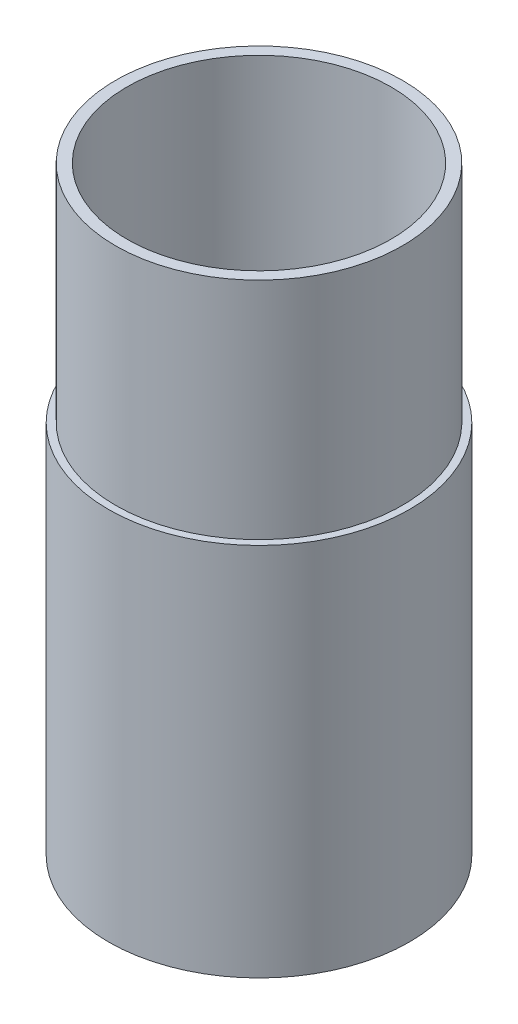
ISO-10303-21;
HEADER;
FILE_DESCRIPTION(('STEP AP214'),'2;1');
FILE_NAME('part.step','',(''),(''),'','','');
FILE_SCHEMA(('AUTOMOTIVE_DESIGN { 1 0 10303 214 1 1 1 1 }'));
ENDSEC;
DATA;
#1=APPLICATION_CONTEXT('core data for automotive mechanical design processes');
#2=APPLICATION_PROTOCOL_DEFINITION('international standard','automotive_design',2000,#1);
#3=PRODUCT_CONTEXT('',#1,'mechanical');
#4=PRODUCT('Part','Part','',(#3));
#5=PRODUCT_RELATED_PRODUCT_CATEGORY('part','',(#4));
#6=PRODUCT_DEFINITION_FORMATION('','',#4);
#7=PRODUCT_DEFINITION_CONTEXT('part definition',#1,'design');
#8=PRODUCT_DEFINITION('design','',#6,#7);
#9=PRODUCT_DEFINITION_SHAPE('','',#8);
#10=(LENGTH_UNIT() NAMED_UNIT(*) SI_UNIT(.MILLI.,.METRE.));
#11=(NAMED_UNIT(*) PLANE_ANGLE_UNIT() SI_UNIT($,.RADIAN.));
#12=(NAMED_UNIT(*) SI_UNIT($,.STERADIAN.) SOLID_ANGLE_UNIT());
#13=UNCERTAINTY_MEASURE_WITH_UNIT(LENGTH_MEASURE(1.E-05),#10,'distance_accuracy_value','');
#14=(GEOMETRIC_REPRESENTATION_CONTEXT(3) GLOBAL_UNCERTAINTY_ASSIGNED_CONTEXT((#13)) GLOBAL_UNIT_ASSIGNED_CONTEXT((#10,
#11,#12)) REPRESENTATION_CONTEXT('',''));
#15=CARTESIAN_POINT('',(0.,0.,0.));
#16=DIRECTION('',(0.,0.,1.));
#17=DIRECTION('',(1.,0.,0.));
#18=AXIS2_PLACEMENT_3D('',#15,#16,#17);
#19=CARTESIAN_POINT('',(0.,-43.5737361166099,0.));
#20=DIRECTION('',(0.,-1.,0.));
#21=DIRECTION('',(0.,0.,-1.));
#22=AXIS2_PLACEMENT_3D('',#19,#20,#21);
#23=PLANE('',#22);
#24=CARTESIAN_POINT('',(0.,-43.5737361166099,0.));
#25=DIRECTION('',(0.,-1.,0.));
#26=DIRECTION('',(0.,0.,-1.));
#27=AXIS2_PLACEMENT_3D('',#24,#25,#26);
#28=CIRCLE('',#27,25.5143000000001);
#29=CARTESIAN_POINT('',(0.,-43.5737361166099,-25.5143000000001));
#30=VERTEX_POINT('',#29);
#31=EDGE_CURVE('E10',#30,#30,#28,.T.);
#32=ORIENTED_EDGE('',*,*,#31,.T.);
#33=EDGE_LOOP('',(#32));
#34=FACE_BOUND('',#33,.T.);
#35=CARTESIAN_POINT('',(0.,-43.5737361166099,0.));
#36=DIRECTION('',(0.,-1.,0.));
#37=DIRECTION('',(0.,0.,-1.));
#38=AXIS2_PLACEMENT_3D('',#35,#36,#37);
#39=CIRCLE('',#38,22.3799124932719);
#40=CARTESIAN_POINT('',(0.,-43.5737361166099,-22.3799124932719));
#41=VERTEX_POINT('',#40);
#42=EDGE_CURVE('E61',#41,#41,#39,.T.);
#43=ORIENTED_EDGE('',*,*,#42,.F.);
#44=EDGE_LOOP('',(#43));
#45=FACE_BOUND('',#44,.T.);
#46=ADVANCED_FACE('F39',(#34,#45),#23,.T.);
#47=CARTESIAN_POINT('',(0.,0.,0.));
#48=DIRECTION('',(0.,-1.,0.));
#49=DIRECTION('',(0.,0.,-1.));
#50=AXIS2_PLACEMENT_3D('',#47,#48,#49);
#51=CYLINDRICAL_SURFACE('',#50,25.5143000000001);
#52=CARTESIAN_POINT('',(0.,19.9262638833901,0.));
#53=DIRECTION('',(0.,-1.,0.));
#54=DIRECTION('',(0.,0.,-1.));
#55=AXIS2_PLACEMENT_3D('',#52,#53,#54);
#56=CIRCLE('',#55,25.5143000000001);
#57=CARTESIAN_POINT('',(0.,19.9262638833901,-25.5143000000001));
#58=VERTEX_POINT('',#57);
#59=EDGE_CURVE('E45',#58,#58,#56,.T.);
#60=ORIENTED_EDGE('',*,*,#59,.T.);
#61=EDGE_LOOP('',(#60));
#62=FACE_BOUND('',#61,.T.);
#63=ORIENTED_EDGE('',*,*,#31,.F.);
#64=EDGE_LOOP('',(#63));
#65=FACE_BOUND('',#64,.T.);
#66=ADVANCED_FACE('F68',(#62,#65),#51,.T.);
#67=CARTESIAN_POINT('',(0.,19.9262638833901,0.));
#68=DIRECTION('',(0.,-1.,0.));
#69=DIRECTION('',(0.,0.,-1.));
#70=AXIS2_PLACEMENT_3D('',#67,#68,#69);
#71=PLANE('',#70);
#72=ORIENTED_EDGE('',*,*,#59,.F.);
#73=EDGE_LOOP('',(#72));
#74=FACE_BOUND('',#73,.T.);
#75=CARTESIAN_POINT('',(0.,19.9262638833901,0.));
#76=DIRECTION('',(0.,-1.,0.));
#77=DIRECTION('',(0.,0.,-1.));
#78=AXIS2_PLACEMENT_3D('',#75,#76,#77);
#79=CIRCLE('',#78,24.3103124932719);
#80=CARTESIAN_POINT('',(0.,19.9262638833901,-24.3103124932719));
#81=VERTEX_POINT('',#80);
#82=EDGE_CURVE('E49',#81,#81,#79,.T.);
#83=ORIENTED_EDGE('',*,*,#82,.T.);
#84=EDGE_LOOP('',(#83));
#85=FACE_BOUND('',#84,.T.);
#86=ADVANCED_FACE('F72',(#74,#85),#71,.F.);
#87=CARTESIAN_POINT('',(0.,0.,0.));
#88=DIRECTION('',(0.,-1.,0.));
#89=DIRECTION('',(0.,0.,-1.));
#90=AXIS2_PLACEMENT_3D('',#87,#88,#89);
#91=CYLINDRICAL_SURFACE('',#90,24.3103124932719);
#92=CARTESIAN_POINT('',(0.,58.0262638833902,0.));
#93=DIRECTION('',(0.,-1.,0.));
#94=DIRECTION('',(0.,0.,-1.));
#95=AXIS2_PLACEMENT_3D('',#92,#93,#94);
#96=CIRCLE('',#95,24.3103124932719);
#97=CARTESIAN_POINT('',(0.,58.0262638833902,-24.3103124932719));
#98=VERTEX_POINT('',#97);
#99=EDGE_CURVE('E53',#98,#98,#96,.T.);
#100=ORIENTED_EDGE('',*,*,#99,.T.);
#101=EDGE_LOOP('',(#100));
#102=FACE_BOUND('',#101,.T.);
#103=ORIENTED_EDGE('',*,*,#82,.F.);
#104=EDGE_LOOP('',(#103));
#105=FACE_BOUND('',#104,.T.);
#106=ADVANCED_FACE('F76',(#102,#105),#91,.T.);
#107=CARTESIAN_POINT('',(0.,58.0262638833902,0.));
#108=DIRECTION('',(0.,-1.,0.));
#109=DIRECTION('',(0.,0.,-1.));
#110=AXIS2_PLACEMENT_3D('',#107,#108,#109);
#111=PLANE('',#110);
#112=ORIENTED_EDGE('',*,*,#99,.F.);
#113=EDGE_LOOP('',(#112));
#114=FACE_BOUND('',#113,.T.);
#115=CARTESIAN_POINT('',(0.,58.0262638833902,0.));
#116=DIRECTION('',(0.,-1.,0.));
#117=DIRECTION('',(0.,0.,-1.));
#118=AXIS2_PLACEMENT_3D('',#115,#116,#117);
#119=CIRCLE('',#118,22.3799124932719);
#120=CARTESIAN_POINT('',(0.,58.0262638833902,-22.3799124932719));
#121=VERTEX_POINT('',#120);
#122=EDGE_CURVE('E58',#121,#121,#119,.T.);
#123=ORIENTED_EDGE('',*,*,#122,.T.);
#124=EDGE_LOOP('',(#123));
#125=FACE_BOUND('',#124,.T.);
#126=ADVANCED_FACE('F83',(#114,#125),#111,.F.);
#127=CARTESIAN_POINT('',(0.,0.,0.));
#128=DIRECTION('',(0.,-1.,0.));
#129=DIRECTION('',(0.,0.,-1.));
#130=AXIS2_PLACEMENT_3D('',#127,#128,#129);
#131=CYLINDRICAL_SURFACE('',#130,22.3799124932719);
#132=ORIENTED_EDGE('',*,*,#122,.F.);
#133=EDGE_LOOP('',(#132));
#134=FACE_BOUND('',#133,.T.);
#135=ORIENTED_EDGE('',*,*,#42,.T.);
#136=EDGE_LOOP('',(#135));
#137=FACE_BOUND('',#136,.T.);
#138=ADVANCED_FACE('F65',(#134,#137),#131,.F.);
#139=CLOSED_SHELL('',(#46,#66,#86,#106,#126,#138));
#140=MANIFOLD_SOLID_BREP('B2',#139);
#141=ADVANCED_BREP_SHAPE_REPRESENTATION('',(#18,#140),#14);
#142=SHAPE_DEFINITION_REPRESENTATION(#9,#141);
ENDSEC;
END-ISO-10303-21;
